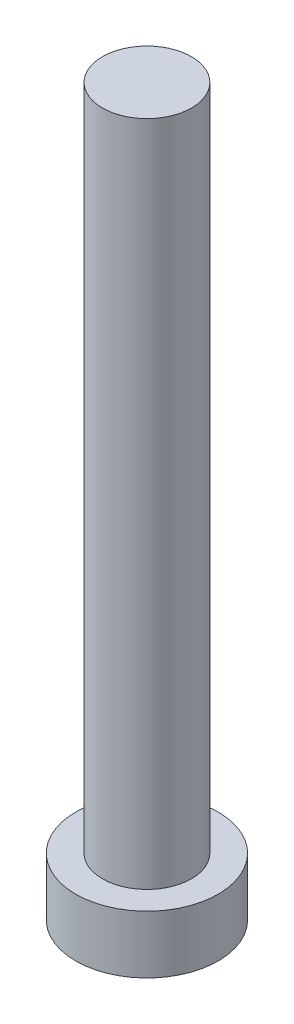
ISO-10303-21;
HEADER;
FILE_DESCRIPTION(('STEP AP214'),'2;1');
FILE_NAME('part.step','',(''),(''),'','','');
FILE_SCHEMA(('AUTOMOTIVE_DESIGN { 1 0 10303 214 1 1 1 1 }'));
ENDSEC;
DATA;
#1=APPLICATION_CONTEXT('core data for automotive mechanical design processes');
#2=APPLICATION_PROTOCOL_DEFINITION('international standard','automotive_design',2000,#1);
#3=PRODUCT_CONTEXT('',#1,'mechanical');
#4=PRODUCT('Part','Part','',(#3));
#5=PRODUCT_RELATED_PRODUCT_CATEGORY('part','',(#4));
#6=PRODUCT_DEFINITION_FORMATION('','',#4);
#7=PRODUCT_DEFINITION_CONTEXT('part definition',#1,'design');
#8=PRODUCT_DEFINITION('design','',#6,#7);
#9=PRODUCT_DEFINITION_SHAPE('','',#8);
#10=(LENGTH_UNIT() NAMED_UNIT(*) SI_UNIT(.MILLI.,.METRE.));
#11=(NAMED_UNIT(*) PLANE_ANGLE_UNIT() SI_UNIT($,.RADIAN.));
#12=(NAMED_UNIT(*) SI_UNIT($,.STERADIAN.) SOLID_ANGLE_UNIT());
#13=UNCERTAINTY_MEASURE_WITH_UNIT(LENGTH_MEASURE(1.E-05),#10,'distance_accuracy_value','');
#14=(GEOMETRIC_REPRESENTATION_CONTEXT(3) GLOBAL_UNCERTAINTY_ASSIGNED_CONTEXT((#13)) GLOBAL_UNIT_ASSIGNED_CONTEXT((#10,
#11,#12)) REPRESENTATION_CONTEXT('',''));
#15=CARTESIAN_POINT('',(0.,0.,0.));
#16=DIRECTION('',(0.,0.,1.));
#17=DIRECTION('',(1.,0.,0.));
#18=AXIS2_PLACEMENT_3D('',#15,#16,#17);
#19=CARTESIAN_POINT('',(0.,1.3,0.));
#20=DIRECTION('',(0.,-1.,0.));
#21=DIRECTION('',(0.,0.,-1.));
#22=AXIS2_PLACEMENT_3D('',#19,#20,#21);
#23=CYLINDRICAL_SURFACE('',#22,1.6);
#24=CARTESIAN_POINT('',(0.,1.3,0.));
#25=DIRECTION('',(0.,1.,0.));
#26=DIRECTION('',(0.,0.,1.));
#27=AXIS2_PLACEMENT_3D('',#24,#25,#26);
#28=CIRCLE('',#27,1.6);
#29=CARTESIAN_POINT('',(0.,1.3,1.6));
#30=VERTEX_POINT('',#29);
#31=EDGE_CURVE('E46',#30,#30,#28,.T.);
#32=ORIENTED_EDGE('',*,*,#31,.F.);
#33=EDGE_LOOP('',(#32));
#34=FACE_BOUND('',#33,.T.);
#35=CARTESIAN_POINT('',(0.,0.,0.));
#36=DIRECTION('',(0.,1.,0.));
#37=DIRECTION('',(0.,0.,1.));
#38=AXIS2_PLACEMENT_3D('',#35,#36,#37);
#39=CIRCLE('',#38,1.6);
#40=CARTESIAN_POINT('',(0.,0.,1.6));
#41=VERTEX_POINT('',#40);
#42=EDGE_CURVE('E42',#41,#41,#39,.T.);
#43=ORIENTED_EDGE('',*,*,#42,.T.);
#44=EDGE_LOOP('',(#43));
#45=FACE_BOUND('',#44,.T.);
#46=ADVANCED_FACE('F39',(#34,#45),#23,.T.);
#47=CARTESIAN_POINT('',(0.,1.3,0.));
#48=DIRECTION('',(0.,1.,0.));
#49=DIRECTION('',(0.,0.,1.));
#50=AXIS2_PLACEMENT_3D('',#47,#48,#49);
#51=PLANE('',#50);
#52=CARTESIAN_POINT('',(0.,1.3,0.));
#53=DIRECTION('',(0.,1.,0.));
#54=DIRECTION('',(0.,0.,1.));
#55=AXIS2_PLACEMENT_3D('',#52,#53,#54);
#56=CIRCLE('',#55,1.);
#57=CARTESIAN_POINT('',(0.,1.3,1.));
#58=VERTEX_POINT('',#57);
#59=EDGE_CURVE('E10',#58,#58,#56,.T.);
#60=ORIENTED_EDGE('',*,*,#59,.F.);
#61=EDGE_LOOP('',(#60));
#62=FACE_BOUND('',#61,.T.);
#63=ORIENTED_EDGE('',*,*,#31,.T.);
#64=EDGE_LOOP('',(#63));
#65=FACE_BOUND('',#64,.T.);
#66=ADVANCED_FACE('F63',(#62,#65),#51,.T.);
#67=CARTESIAN_POINT('',(0.,0.,0.));
#68=DIRECTION('',(0.,1.,0.));
#69=DIRECTION('',(0.,0.,1.));
#70=AXIS2_PLACEMENT_3D('',#67,#68,#69);
#71=PLANE('',#70);
#72=ORIENTED_EDGE('',*,*,#42,.F.);
#73=EDGE_LOOP('',(#72));
#74=FACE_BOUND('',#73,.T.);
#75=ADVANCED_FACE('F60',(#74),#71,.F.);
#76=CARTESIAN_POINT('',(0.,16.3,0.));
#77=DIRECTION('',(0.,-1.,0.));
#78=DIRECTION('',(0.,0.,-1.));
#79=AXIS2_PLACEMENT_3D('',#76,#77,#78);
#80=CYLINDRICAL_SURFACE('',#79,1.);
#81=CARTESIAN_POINT('',(0.,16.3,0.));
#82=DIRECTION('',(0.,1.,0.));
#83=DIRECTION('',(0.,0.,1.));
#84=AXIS2_PLACEMENT_3D('',#81,#82,#83);
#85=CIRCLE('',#84,1.);
#86=CARTESIAN_POINT('',(0.,16.3,1.));
#87=VERTEX_POINT('',#86);
#88=EDGE_CURVE('E52',#87,#87,#85,.T.);
#89=ORIENTED_EDGE('',*,*,#88,.F.);
#90=EDGE_LOOP('',(#89));
#91=FACE_BOUND('',#90,.T.);
#92=ORIENTED_EDGE('',*,*,#59,.T.);
#93=EDGE_LOOP('',(#92));
#94=FACE_BOUND('',#93,.T.);
#95=ADVANCED_FACE('F62',(#91,#94),#80,.T.);
#96=CARTESIAN_POINT('',(0.,16.3,0.));
#97=DIRECTION('',(0.,1.,0.));
#98=DIRECTION('',(0.,0.,1.));
#99=AXIS2_PLACEMENT_3D('',#96,#97,#98);
#100=PLANE('',#99);
#101=ORIENTED_EDGE('',*,*,#88,.T.);
#102=EDGE_LOOP('',(#101));
#103=FACE_BOUND('',#102,.T.);
#104=ADVANCED_FACE('F68',(#103),#100,.T.);
#105=CLOSED_SHELL('',(#46,#66,#75,#95,#104));
#106=MANIFOLD_SOLID_BREP('B2',#105);
#107=ADVANCED_BREP_SHAPE_REPRESENTATION('',(#18,#106),#14);
#108=SHAPE_DEFINITION_REPRESENTATION(#9,#107);
ENDSEC;
END-ISO-10303-21;
